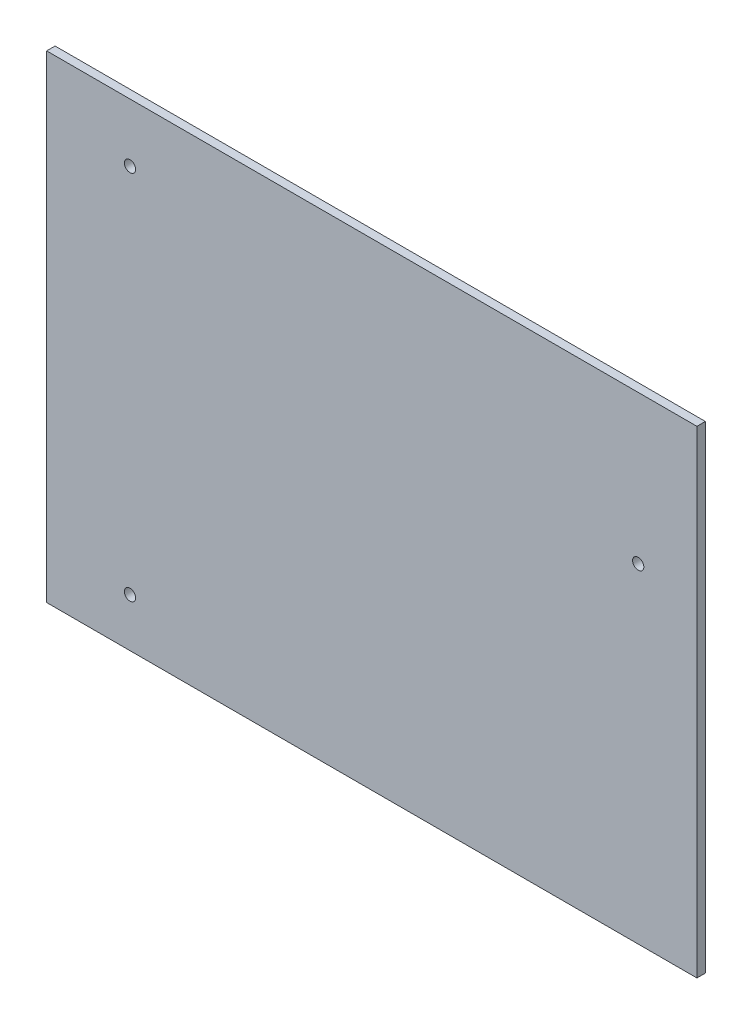
ISO-10303-21;
HEADER;
FILE_DESCRIPTION(('STEP AP214'),'2;1');
FILE_NAME('part.step','',(''),(''),'','','');
FILE_SCHEMA(('AUTOMOTIVE_DESIGN { 1 0 10303 214 1 1 1 1 }'));
ENDSEC;
DATA;
#1=APPLICATION_CONTEXT('core data for automotive mechanical design processes');
#2=APPLICATION_PROTOCOL_DEFINITION('international standard','automotive_design',2000,#1);
#3=PRODUCT_CONTEXT('',#1,'mechanical');
#4=PRODUCT('Part','Part','',(#3));
#5=PRODUCT_RELATED_PRODUCT_CATEGORY('part','',(#4));
#6=PRODUCT_DEFINITION_FORMATION('','',#4);
#7=PRODUCT_DEFINITION_CONTEXT('part definition',#1,'design');
#8=PRODUCT_DEFINITION('design','',#6,#7);
#9=PRODUCT_DEFINITION_SHAPE('','',#8);
#10=(LENGTH_UNIT() NAMED_UNIT(*) SI_UNIT(.MILLI.,.METRE.));
#11=(NAMED_UNIT(*) PLANE_ANGLE_UNIT() SI_UNIT($,.RADIAN.));
#12=(NAMED_UNIT(*) SI_UNIT($,.STERADIAN.) SOLID_ANGLE_UNIT());
#13=UNCERTAINTY_MEASURE_WITH_UNIT(LENGTH_MEASURE(1.E-05),#10,'distance_accuracy_value','');
#14=(GEOMETRIC_REPRESENTATION_CONTEXT(3) GLOBAL_UNCERTAINTY_ASSIGNED_CONTEXT((#13)) GLOBAL_UNIT_ASSIGNED_CONTEXT((#10,
#11,#12)) REPRESENTATION_CONTEXT('',''));
#15=CARTESIAN_POINT('',(0.,0.,0.));
#16=DIRECTION('',(0.,0.,1.));
#17=DIRECTION('',(1.,0.,0.));
#18=AXIS2_PLACEMENT_3D('',#15,#16,#17);
#19=CARTESIAN_POINT('',(0.,0.,3.));
#20=DIRECTION('',(0.,0.,-1.));
#21=DIRECTION('',(-1.,0.,0.));
#22=AXIS2_PLACEMENT_3D('',#19,#20,#21);
#23=PLANE('',#22);
#24=CARTESIAN_POINT('',(216.068181509481,132.8104082052,3.));
#25=DIRECTION('',(0.,0.,1.));
#26=DIRECTION('',(1.,0.,0.));
#27=AXIS2_PLACEMENT_3D('',#24,#25,#26);
#28=CIRCLE('',#27,2.);
#29=CARTESIAN_POINT('',(218.068181509481,132.8104082052,3.));
#30=VERTEX_POINT('',#29);
#31=EDGE_CURVE('E193',#30,#30,#28,.T.);
#32=ORIENTED_EDGE('',*,*,#31,.F.);
#33=EDGE_LOOP('',(#32));
#34=FACE_BOUND('',#33,.T.);
#35=DIRECTION('',(1.,0.,0.));
#36=VECTOR('',#35,1.);
#37=CARTESIAN_POINT('',(5.62124617617843,185.597480795308,3.));
#38=LINE('',#37,#36);
#39=CARTESIAN_POINT('',(5.62124617617843,185.597480795308,3.));
#40=VERTEX_POINT('',#39);
#41=CARTESIAN_POINT('',(236.96095101564,185.597480795308,3.));
#42=VERTEX_POINT('',#41);
#43=EDGE_CURVE('E139',#40,#42,#38,.T.);
#44=ORIENTED_EDGE('',*,*,#43,.F.);
#45=DIRECTION('',(0.,-1.,0.));
#46=VECTOR('',#45,1.);
#47=CARTESIAN_POINT('',(5.62124617617843,185.597480795308,3.));
#48=LINE('',#47,#46);
#49=CARTESIAN_POINT('',(5.62124617617845,15.6259108705398,3.));
#50=VERTEX_POINT('',#49);
#51=EDGE_CURVE('E129',#40,#50,#48,.T.);
#52=ORIENTED_EDGE('',*,*,#51,.T.);
#53=DIRECTION('',(1.,0.,0.));
#54=VECTOR('',#53,1.);
#55=CARTESIAN_POINT('',(5.62124617617845,15.6259108705398,3.));
#56=LINE('',#55,#54);
#57=CARTESIAN_POINT('',(236.96095101564,15.6259108705398,3.));
#58=VERTEX_POINT('',#57);
#59=EDGE_CURVE('E124',#50,#58,#56,.T.);
#60=ORIENTED_EDGE('',*,*,#59,.T.);
#61=DIRECTION('',(0.,-1.,0.));
#62=VECTOR('',#61,1.);
#63=CARTESIAN_POINT('',(236.96095101564,185.597480795308,3.));
#64=LINE('',#63,#62);
#65=EDGE_CURVE('E128',#42,#58,#64,.T.);
#66=ORIENTED_EDGE('',*,*,#65,.F.);
#67=EDGE_LOOP('',(#44,#52,#60,#66));
#68=FACE_BOUND('',#67,.T.);
#69=CARTESIAN_POINT('',(35.2797705609263,32.8768534465684,3.));
#70=DIRECTION('',(0.,0.,1.));
#71=DIRECTION('',(1.,0.,0.));
#72=AXIS2_PLACEMENT_3D('',#69,#70,#71);
#73=CIRCLE('',#72,2.);
#74=CARTESIAN_POINT('',(37.2797705609263,32.8768534465684,3.));
#75=VERTEX_POINT('',#74);
#76=EDGE_CURVE('E149',#75,#75,#73,.T.);
#77=ORIENTED_EDGE('',*,*,#76,.F.);
#78=EDGE_LOOP('',(#77));
#79=FACE_BOUND('',#78,.T.);
#80=CARTESIAN_POINT('',(35.2797705609263,164.908609458789,3.));
#81=DIRECTION('',(0.,0.,1.));
#82=DIRECTION('',(1.,0.,0.));
#83=AXIS2_PLACEMENT_3D('',#80,#81,#82);
#84=CIRCLE('',#83,2.);
#85=CARTESIAN_POINT('',(37.2797705609263,164.908609458789,3.));
#86=VERTEX_POINT('',#85);
#87=EDGE_CURVE('E200',#86,#86,#84,.T.);
#88=ORIENTED_EDGE('',*,*,#87,.F.);
#89=EDGE_LOOP('',(#88));
#90=FACE_BOUND('',#89,.T.);
#91=ADVANCED_FACE('F78',(#34,#68,#79,#90),#23,.F.);
#92=CARTESIAN_POINT('',(0.,0.,0.));
#93=DIRECTION('',(0.,0.,-1.));
#94=DIRECTION('',(-1.,0.,0.));
#95=AXIS2_PLACEMENT_3D('',#92,#93,#94);
#96=PLANE('',#95);
#97=CARTESIAN_POINT('',(216.068181509481,132.8104082052,0.));
#98=DIRECTION('',(0.,0.,1.));
#99=DIRECTION('',(1.,0.,0.));
#100=AXIS2_PLACEMENT_3D('',#97,#98,#99);
#101=CIRCLE('',#100,2.);
#102=CARTESIAN_POINT('',(218.068181509481,132.8104082052,0.));
#103=VERTEX_POINT('',#102);
#104=EDGE_CURVE('E196',#103,#103,#101,.T.);
#105=ORIENTED_EDGE('',*,*,#104,.T.);
#106=EDGE_LOOP('',(#105));
#107=FACE_BOUND('',#106,.T.);
#108=DIRECTION('',(1.,0.,0.));
#109=VECTOR('',#108,1.);
#110=CARTESIAN_POINT('',(5.62124617617843,185.597480795308,0.));
#111=LINE('',#110,#109);
#112=CARTESIAN_POINT('',(5.62124617617843,185.597480795308,0.));
#113=VERTEX_POINT('',#112);
#114=CARTESIAN_POINT('',(236.96095101564,185.597480795308,0.));
#115=VERTEX_POINT('',#114);
#116=EDGE_CURVE('E145',#113,#115,#111,.T.);
#117=ORIENTED_EDGE('',*,*,#116,.T.);
#118=DIRECTION('',(0.,-1.,0.));
#119=VECTOR('',#118,1.);
#120=CARTESIAN_POINT('',(236.96095101564,185.597480795308,0.));
#121=LINE('',#120,#119);
#122=CARTESIAN_POINT('',(236.96095101564,15.6259108705398,0.));
#123=VERTEX_POINT('',#122);
#124=EDGE_CURVE('E148',#115,#123,#121,.T.);
#125=ORIENTED_EDGE('',*,*,#124,.T.);
#126=DIRECTION('',(1.,0.,0.));
#127=VECTOR('',#126,1.);
#128=CARTESIAN_POINT('',(5.62124617617845,15.6259108705398,0.));
#129=LINE('',#128,#127);
#130=CARTESIAN_POINT('',(5.62124617617845,15.6259108705398,0.));
#131=VERTEX_POINT('',#130);
#132=EDGE_CURVE('E136',#131,#123,#129,.T.);
#133=ORIENTED_EDGE('',*,*,#132,.F.);
#134=DIRECTION('',(0.,-1.,0.));
#135=VECTOR('',#134,1.);
#136=CARTESIAN_POINT('',(5.62124617617843,185.597480795308,0.));
#137=LINE('',#136,#135);
#138=EDGE_CURVE('E112',#113,#131,#137,.T.);
#139=ORIENTED_EDGE('',*,*,#138,.F.);
#140=EDGE_LOOP('',(#117,#125,#133,#139));
#141=FACE_BOUND('',#140,.T.);
#142=CARTESIAN_POINT('',(35.2797705609263,32.8768534465684,0.));
#143=DIRECTION('',(0.,0.,1.));
#144=DIRECTION('',(1.,0.,0.));
#145=AXIS2_PLACEMENT_3D('',#142,#143,#144);
#146=CIRCLE('',#145,2.);
#147=CARTESIAN_POINT('',(37.2797705609263,32.8768534465684,0.));
#148=VERTEX_POINT('',#147);
#149=EDGE_CURVE('E192',#148,#148,#146,.T.);
#150=ORIENTED_EDGE('',*,*,#149,.T.);
#151=EDGE_LOOP('',(#150));
#152=FACE_BOUND('',#151,.T.);
#153=CARTESIAN_POINT('',(35.2797705609263,164.908609458789,0.));
#154=DIRECTION('',(0.,0.,1.));
#155=DIRECTION('',(1.,0.,0.));
#156=AXIS2_PLACEMENT_3D('',#153,#154,#155);
#157=CIRCLE('',#156,2.);
#158=CARTESIAN_POINT('',(37.2797705609263,164.908609458789,0.));
#159=VERTEX_POINT('',#158);
#160=EDGE_CURVE('E202',#159,#159,#157,.T.);
#161=ORIENTED_EDGE('',*,*,#160,.T.);
#162=EDGE_LOOP('',(#161));
#163=FACE_BOUND('',#162,.T.);
#164=ADVANCED_FACE('F154',(#107,#141,#152,#163),#96,.T.);
#165=CARTESIAN_POINT('',(5.62124617617843,185.597480795308,3.));
#166=DIRECTION('',(0.,1.,0.));
#167=DIRECTION('',(0.,0.,1.));
#168=AXIS2_PLACEMENT_3D('',#165,#166,#167);
#169=PLANE('',#168);
#170=ORIENTED_EDGE('',*,*,#116,.F.);
#171=DIRECTION('',(0.,0.,-1.));
#172=VECTOR('',#171,1.);
#173=CARTESIAN_POINT('',(5.62124617617843,185.597480795308,3.));
#174=LINE('',#173,#172);
#175=EDGE_CURVE('E12',#40,#113,#174,.T.);
#176=ORIENTED_EDGE('',*,*,#175,.F.);
#177=ORIENTED_EDGE('',*,*,#43,.T.);
#178=DIRECTION('',(0.,0.,-1.));
#179=VECTOR('',#178,1.);
#180=CARTESIAN_POINT('',(236.96095101564,185.597480795308,3.));
#181=LINE('',#180,#179);
#182=EDGE_CURVE('E82',#42,#115,#181,.T.);
#183=ORIENTED_EDGE('',*,*,#182,.T.);
#184=EDGE_LOOP('',(#170,#176,#177,#183));
#185=FACE_BOUND('',#184,.T.);
#186=ADVANCED_FACE('F80',(#185),#169,.T.);
#187=CARTESIAN_POINT('',(5.62124617617843,185.597480795308,3.));
#188=DIRECTION('',(1.,0.,0.));
#189=DIRECTION('',(0.,1.,0.));
#190=AXIS2_PLACEMENT_3D('',#187,#188,#189);
#191=PLANE('',#190);
#192=ORIENTED_EDGE('',*,*,#138,.T.);
#193=DIRECTION('',(0.,0.,-1.));
#194=VECTOR('',#193,1.);
#195=CARTESIAN_POINT('',(5.62124617617845,15.6259108705398,3.));
#196=LINE('',#195,#194);
#197=EDGE_CURVE('E88',#50,#131,#196,.T.);
#198=ORIENTED_EDGE('',*,*,#197,.F.);
#199=ORIENTED_EDGE('',*,*,#51,.F.);
#200=ORIENTED_EDGE('',*,*,#175,.T.);
#201=EDGE_LOOP('',(#192,#198,#199,#200));
#202=FACE_BOUND('',#201,.T.);
#203=ADVANCED_FACE('F157',(#202),#191,.F.);
#204=CARTESIAN_POINT('',(5.62124617617845,15.6259108705398,3.));
#205=DIRECTION('',(0.,1.,0.));
#206=DIRECTION('',(0.,0.,1.));
#207=AXIS2_PLACEMENT_3D('',#204,#205,#206);
#208=PLANE('',#207);
#209=ORIENTED_EDGE('',*,*,#132,.T.);
#210=DIRECTION('',(0.,0.,-1.));
#211=VECTOR('',#210,1.);
#212=CARTESIAN_POINT('',(236.96095101564,15.6259108705398,3.));
#213=LINE('',#212,#211);
#214=EDGE_CURVE('E133',#58,#123,#213,.T.);
#215=ORIENTED_EDGE('',*,*,#214,.F.);
#216=ORIENTED_EDGE('',*,*,#59,.F.);
#217=ORIENTED_EDGE('',*,*,#197,.T.);
#218=EDGE_LOOP('',(#209,#215,#216,#217));
#219=FACE_BOUND('',#218,.T.);
#220=ADVANCED_FACE('F134',(#219),#208,.F.);
#221=CARTESIAN_POINT('',(236.96095101564,185.597480795308,3.));
#222=DIRECTION('',(1.,0.,0.));
#223=DIRECTION('',(0.,1.,0.));
#224=AXIS2_PLACEMENT_3D('',#221,#222,#223);
#225=PLANE('',#224);
#226=ORIENTED_EDGE('',*,*,#124,.F.);
#227=ORIENTED_EDGE('',*,*,#182,.F.);
#228=ORIENTED_EDGE('',*,*,#65,.T.);
#229=ORIENTED_EDGE('',*,*,#214,.T.);
#230=EDGE_LOOP('',(#226,#227,#228,#229));
#231=FACE_BOUND('',#230,.T.);
#232=ADVANCED_FACE('F138',(#231),#225,.T.);
#233=CARTESIAN_POINT('',(35.2797705609263,32.8768534465684,3.));
#234=DIRECTION('',(0.,0.,-1.));
#235=DIRECTION('',(-1.,0.,0.));
#236=AXIS2_PLACEMENT_3D('',#233,#234,#235);
#237=CYLINDRICAL_SURFACE('',#236,2.);
#238=ORIENTED_EDGE('',*,*,#76,.T.);
#239=EDGE_LOOP('',(#238));
#240=FACE_BOUND('',#239,.T.);
#241=ORIENTED_EDGE('',*,*,#149,.F.);
#242=EDGE_LOOP('',(#241));
#243=FACE_BOUND('',#242,.T.);
#244=ADVANCED_FACE('F172',(#240,#243),#237,.F.);
#245=CARTESIAN_POINT('',(216.068181509481,132.8104082052,3.));
#246=DIRECTION('',(0.,0.,-1.));
#247=DIRECTION('',(-1.,0.,0.));
#248=AXIS2_PLACEMENT_3D('',#245,#246,#247);
#249=CYLINDRICAL_SURFACE('',#248,2.);
#250=ORIENTED_EDGE('',*,*,#31,.T.);
#251=EDGE_LOOP('',(#250));
#252=FACE_BOUND('',#251,.T.);
#253=ORIENTED_EDGE('',*,*,#104,.F.);
#254=EDGE_LOOP('',(#253));
#255=FACE_BOUND('',#254,.T.);
#256=ADVANCED_FACE('F180',(#252,#255),#249,.F.);
#257=CARTESIAN_POINT('',(35.2797705609263,164.908609458789,3.));
#258=DIRECTION('',(0.,0.,-1.));
#259=DIRECTION('',(-1.,0.,0.));
#260=AXIS2_PLACEMENT_3D('',#257,#258,#259);
#261=CYLINDRICAL_SURFACE('',#260,2.);
#262=ORIENTED_EDGE('',*,*,#87,.T.);
#263=EDGE_LOOP('',(#262));
#264=FACE_BOUND('',#263,.T.);
#265=ORIENTED_EDGE('',*,*,#160,.F.);
#266=EDGE_LOOP('',(#265));
#267=FACE_BOUND('',#266,.T.);
#268=ADVANCED_FACE('F185',(#264,#267),#261,.F.);
#269=CLOSED_SHELL('',(#91,#164,#186,#203,#220,#232,#244,#256,#268));
#270=MANIFOLD_SOLID_BREP('B2',#269);
#271=ADVANCED_BREP_SHAPE_REPRESENTATION('',(#18,#270),#14);
#272=SHAPE_DEFINITION_REPRESENTATION(#9,#271);
ENDSEC;
END-ISO-10303-21;
